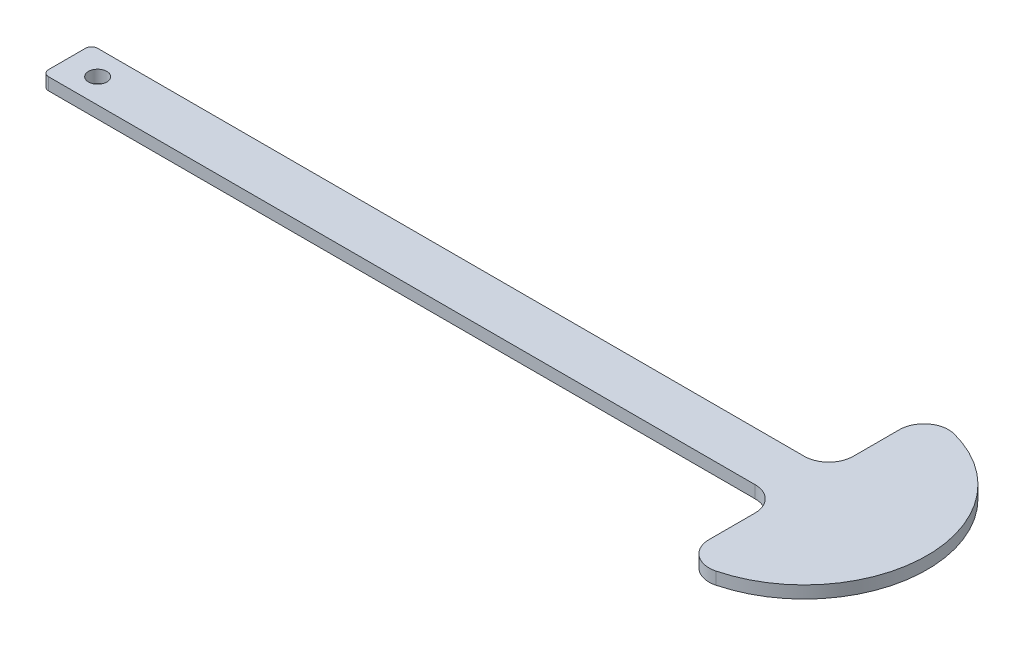
ISO-10303-21;
HEADER;
FILE_DESCRIPTION(('STEP AP214'),'2;1');
FILE_NAME('part.step','',(''),(''),'','','');
FILE_SCHEMA(('AUTOMOTIVE_DESIGN { 1 0 10303 214 1 1 1 1 }'));
ENDSEC;
DATA;
#1=APPLICATION_CONTEXT('core data for automotive mechanical design processes');
#2=APPLICATION_PROTOCOL_DEFINITION('international standard','automotive_design',2000,#1);
#3=PRODUCT_CONTEXT('',#1,'mechanical');
#4=PRODUCT('Part','Part','',(#3));
#5=PRODUCT_RELATED_PRODUCT_CATEGORY('part','',(#4));
#6=PRODUCT_DEFINITION_FORMATION('','',#4);
#7=PRODUCT_DEFINITION_CONTEXT('part definition',#1,'design');
#8=PRODUCT_DEFINITION('design','',#6,#7);
#9=PRODUCT_DEFINITION_SHAPE('','',#8);
#10=(LENGTH_UNIT() NAMED_UNIT(*) SI_UNIT(.MILLI.,.METRE.));
#11=(NAMED_UNIT(*) PLANE_ANGLE_UNIT() SI_UNIT($,.RADIAN.));
#12=(NAMED_UNIT(*) SI_UNIT($,.STERADIAN.) SOLID_ANGLE_UNIT());
#13=UNCERTAINTY_MEASURE_WITH_UNIT(LENGTH_MEASURE(1.E-05),#10,'distance_accuracy_value','');
#14=(GEOMETRIC_REPRESENTATION_CONTEXT(3) GLOBAL_UNCERTAINTY_ASSIGNED_CONTEXT((#13)) GLOBAL_UNIT_ASSIGNED_CONTEXT((#10,
#11,#12)) REPRESENTATION_CONTEXT('',''));
#15=CARTESIAN_POINT('',(0.,0.,0.));
#16=DIRECTION('',(0.,0.,1.));
#17=DIRECTION('',(1.,0.,0.));
#18=AXIS2_PLACEMENT_3D('',#15,#16,#17);
#19=CARTESIAN_POINT('',(55.9999999999999,2.,8.));
#20=DIRECTION('',(0.,-1.,0.));
#21=DIRECTION('',(0.,0.,-1.));
#22=AXIS2_PLACEMENT_3D('',#19,#20,#21);
#23=PLANE('',#22);
#24=CARTESIAN_POINT('',(55.9999999999999,2.,8.));
#25=DIRECTION('',(0.,-1.,0.));
#26=DIRECTION('',(0.,0.,-1.));
#27=AXIS2_PLACEMENT_3D('',#24,#25,#26);
#28=CIRCLE('',#27,4.);
#29=CARTESIAN_POINT('',(55.9999999999999,2.,4.));
#30=VERTEX_POINT('',#29);
#31=CARTESIAN_POINT('',(59.9999999999999,2.,8.00000000000003));
#32=VERTEX_POINT('',#31);
#33=EDGE_CURVE('E200',#30,#32,#28,.T.);
#34=ORIENTED_EDGE('',*,*,#33,.T.);
#35=DIRECTION('',(0.,0.,1.));
#36=VECTOR('',#35,1.);
#37=CARTESIAN_POINT('',(59.9999999999999,2.,8.00000000000003));
#38=LINE('',#37,#36);
#39=CARTESIAN_POINT('',(59.9999999999999,2.,15.4919333848297));
#40=VERTEX_POINT('',#39);
#41=EDGE_CURVE('E112',#32,#40,#38,.T.);
#42=ORIENTED_EDGE('',*,*,#41,.T.);
#43=CARTESIAN_POINT('',(63.9999999999999,2.,15.4919333848297));
#44=DIRECTION('',(0.,1.,0.));
#45=DIRECTION('',(0.,0.,1.));
#46=AXIS2_PLACEMENT_3D('',#43,#44,#45);
#47=CIRCLE('',#46,4.);
#48=CARTESIAN_POINT('',(64.9999999999999,2.,19.3649167310371));
#49=VERTEX_POINT('',#48);
#50=EDGE_CURVE('E237',#40,#49,#47,.T.);
#51=ORIENTED_EDGE('',*,*,#50,.T.);
#52=CARTESIAN_POINT('',(59.9999999999999,2.,0.));
#53=DIRECTION('',(0.,1.,0.));
#54=DIRECTION('',(0.,0.,1.));
#55=AXIS2_PLACEMENT_3D('',#52,#53,#54);
#56=CIRCLE('',#55,20.);
#57=CARTESIAN_POINT('',(64.9999999999999,2.,-19.3649167310371));
#58=VERTEX_POINT('',#57);
#59=EDGE_CURVE('E257',#49,#58,#56,.T.);
#60=ORIENTED_EDGE('',*,*,#59,.T.);
#61=CARTESIAN_POINT('',(63.9999999999999,2.,-15.4919333848297));
#62=DIRECTION('',(0.,1.,0.));
#63=DIRECTION('',(0.,0.,-1.));
#64=AXIS2_PLACEMENT_3D('',#61,#62,#63);
#65=CIRCLE('',#64,4.);
#66=CARTESIAN_POINT('',(59.9999999999999,2.,-15.4919333848297));
#67=VERTEX_POINT('',#66);
#68=EDGE_CURVE('E253',#58,#67,#65,.T.);
#69=ORIENTED_EDGE('',*,*,#68,.T.);
#70=DIRECTION('',(0.,0.,1.));
#71=VECTOR('',#70,1.);
#72=CARTESIAN_POINT('',(59.9999999999999,2.,-15.4919333848297));
#73=LINE('',#72,#71);
#74=CARTESIAN_POINT('',(59.9999999999999,2.,-8.00000000000003));
#75=VERTEX_POINT('',#74);
#76=EDGE_CURVE('E256',#67,#75,#73,.T.);
#77=ORIENTED_EDGE('',*,*,#76,.T.);
#78=CARTESIAN_POINT('',(55.9999999999999,2.,-8.));
#79=DIRECTION('',(0.,-1.,0.));
#80=DIRECTION('',(0.,0.,1.));
#81=AXIS2_PLACEMENT_3D('',#78,#79,#80);
#82=CIRCLE('',#81,4.);
#83=CARTESIAN_POINT('',(55.9999999999999,2.,-4.));
#84=VERTEX_POINT('',#83);
#85=EDGE_CURVE('E261',#75,#84,#82,.T.);
#86=ORIENTED_EDGE('',*,*,#85,.T.);
#87=DIRECTION('',(-1.,0.,0.));
#88=VECTOR('',#87,1.);
#89=CARTESIAN_POINT('',(-59.0000000000001,2.,-4.));
#90=LINE('',#89,#88);
#91=CARTESIAN_POINT('',(-59.0000000000001,2.,-4.));
#92=VERTEX_POINT('',#91);
#93=EDGE_CURVE('E268',#84,#92,#90,.T.);
#94=ORIENTED_EDGE('',*,*,#93,.T.);
#95=CARTESIAN_POINT('',(-59.0000000000001,2.,-3.));
#96=DIRECTION('',(0.,1.,0.));
#97=DIRECTION('',(0.,0.,1.));
#98=AXIS2_PLACEMENT_3D('',#95,#96,#97);
#99=CIRCLE('',#98,1.);
#100=CARTESIAN_POINT('',(-60.0000000000001,2.,-2.99999999999999));
#101=VERTEX_POINT('',#100);
#102=EDGE_CURVE('E143',#92,#101,#99,.T.);
#103=ORIENTED_EDGE('',*,*,#102,.T.);
#104=DIRECTION('',(0.,0.,1.));
#105=VECTOR('',#104,1.);
#106=CARTESIAN_POINT('',(-60.0000000000001,2.,-2.99999999999999));
#107=LINE('',#106,#105);
#108=CARTESIAN_POINT('',(-60.0000000000001,2.,2.99999999999999));
#109=VERTEX_POINT('',#108);
#110=EDGE_CURVE('E137',#101,#109,#107,.T.);
#111=ORIENTED_EDGE('',*,*,#110,.T.);
#112=CARTESIAN_POINT('',(-59.0000000000001,2.,3.));
#113=DIRECTION('',(0.,1.,0.));
#114=DIRECTION('',(0.,0.,1.));
#115=AXIS2_PLACEMENT_3D('',#112,#113,#114);
#116=CIRCLE('',#115,1.);
#117=CARTESIAN_POINT('',(-59.,2.,4.));
#118=VERTEX_POINT('',#117);
#119=EDGE_CURVE('E141',#109,#118,#116,.T.);
#120=ORIENTED_EDGE('',*,*,#119,.T.);
#121=DIRECTION('',(1.,0.,0.));
#122=VECTOR('',#121,1.);
#123=CARTESIAN_POINT('',(-59.,2.,4.));
#124=LINE('',#123,#122);
#125=EDGE_CURVE('E57',#118,#30,#124,.T.);
#126=ORIENTED_EDGE('',*,*,#125,.T.);
#127=EDGE_LOOP('',(#34,#42,#51,#60,#69,#77,#86,#94,#103,#111,#120,#126));
#128=FACE_BOUND('',#127,.T.);
#129=CARTESIAN_POINT('',(-55.0000000000001,2.,0.));
#130=DIRECTION('',(0.,1.,0.));
#131=DIRECTION('',(0.,0.,1.));
#132=AXIS2_PLACEMENT_3D('',#129,#130,#131);
#133=CIRCLE('',#132,1.5);
#134=CARTESIAN_POINT('',(-55.0000000000001,2.,1.5));
#135=VERTEX_POINT('',#134);
#136=EDGE_CURVE('E170',#135,#135,#133,.T.);
#137=ORIENTED_EDGE('',*,*,#136,.F.);
#138=EDGE_LOOP('',(#137));
#139=FACE_BOUND('',#138,.T.);
#140=ADVANCED_FACE('F39',(#128,#139),#23,.F.);
#141=CARTESIAN_POINT('',(55.9999999999999,0.,8.));
#142=DIRECTION('',(0.,-1.,0.));
#143=DIRECTION('',(0.,0.,-1.));
#144=AXIS2_PLACEMENT_3D('',#141,#142,#143);
#145=PLANE('',#144);
#146=CARTESIAN_POINT('',(55.9999999999999,0.,8.));
#147=DIRECTION('',(0.,-1.,0.));
#148=DIRECTION('',(0.,0.,-1.));
#149=AXIS2_PLACEMENT_3D('',#146,#147,#148);
#150=CIRCLE('',#149,4.);
#151=CARTESIAN_POINT('',(55.9999999999999,0.,4.));
#152=VERTEX_POINT('',#151);
#153=CARTESIAN_POINT('',(59.9999999999999,0.,8.00000000000003));
#154=VERTEX_POINT('',#153);
#155=EDGE_CURVE('E165',#152,#154,#150,.T.);
#156=ORIENTED_EDGE('',*,*,#155,.F.);
#157=DIRECTION('',(1.,0.,0.));
#158=VECTOR('',#157,1.);
#159=CARTESIAN_POINT('',(-59.,0.,4.));
#160=LINE('',#159,#158);
#161=CARTESIAN_POINT('',(-59.,0.,4.));
#162=VERTEX_POINT('',#161);
#163=EDGE_CURVE('E104',#162,#152,#160,.T.);
#164=ORIENTED_EDGE('',*,*,#163,.F.);
#165=CARTESIAN_POINT('',(-59.0000000000001,0.,3.));
#166=DIRECTION('',(0.,1.,0.));
#167=DIRECTION('',(0.,0.,1.));
#168=AXIS2_PLACEMENT_3D('',#165,#166,#167);
#169=CIRCLE('',#168,1.);
#170=CARTESIAN_POINT('',(-60.0000000000001,0.,2.99999999999999));
#171=VERTEX_POINT('',#170);
#172=EDGE_CURVE('E98',#171,#162,#169,.T.);
#173=ORIENTED_EDGE('',*,*,#172,.F.);
#174=DIRECTION('',(0.,0.,1.));
#175=VECTOR('',#174,1.);
#176=CARTESIAN_POINT('',(-60.0000000000001,0.,-2.99999999999999));
#177=LINE('',#176,#175);
#178=CARTESIAN_POINT('',(-60.0000000000001,0.,-2.99999999999999));
#179=VERTEX_POINT('',#178);
#180=EDGE_CURVE('E152',#179,#171,#177,.T.);
#181=ORIENTED_EDGE('',*,*,#180,.F.);
#182=CARTESIAN_POINT('',(-59.0000000000001,0.,-3.));
#183=DIRECTION('',(0.,1.,0.));
#184=DIRECTION('',(0.,0.,1.));
#185=AXIS2_PLACEMENT_3D('',#182,#183,#184);
#186=CIRCLE('',#185,1.);
#187=CARTESIAN_POINT('',(-59.0000000000001,0.,-4.));
#188=VERTEX_POINT('',#187);
#189=EDGE_CURVE('E191',#188,#179,#186,.T.);
#190=ORIENTED_EDGE('',*,*,#189,.F.);
#191=DIRECTION('',(-1.,0.,0.));
#192=VECTOR('',#191,1.);
#193=CARTESIAN_POINT('',(-59.0000000000001,0.,-4.));
#194=LINE('',#193,#192);
#195=CARTESIAN_POINT('',(55.9999999999999,0.,-4.));
#196=VERTEX_POINT('',#195);
#197=EDGE_CURVE('E188',#196,#188,#194,.T.);
#198=ORIENTED_EDGE('',*,*,#197,.F.);
#199=CARTESIAN_POINT('',(55.9999999999999,0.,-8.));
#200=DIRECTION('',(0.,-1.,0.));
#201=DIRECTION('',(0.,0.,1.));
#202=AXIS2_PLACEMENT_3D('',#199,#200,#201);
#203=CIRCLE('',#202,4.);
#204=CARTESIAN_POINT('',(59.9999999999999,0.,-8.00000000000003));
#205=VERTEX_POINT('',#204);
#206=EDGE_CURVE('E185',#205,#196,#203,.T.);
#207=ORIENTED_EDGE('',*,*,#206,.F.);
#208=DIRECTION('',(0.,0.,1.));
#209=VECTOR('',#208,1.);
#210=CARTESIAN_POINT('',(59.9999999999999,0.,-15.4919333848297));
#211=LINE('',#210,#209);
#212=CARTESIAN_POINT('',(59.9999999999999,0.,-15.4919333848297));
#213=VERTEX_POINT('',#212);
#214=EDGE_CURVE('E182',#213,#205,#211,.T.);
#215=ORIENTED_EDGE('',*,*,#214,.F.);
#216=CARTESIAN_POINT('',(63.9999999999999,0.,-15.4919333848297));
#217=DIRECTION('',(0.,1.,0.));
#218=DIRECTION('',(0.,0.,-1.));
#219=AXIS2_PLACEMENT_3D('',#216,#217,#218);
#220=CIRCLE('',#219,4.);
#221=CARTESIAN_POINT('',(64.9999999999999,0.,-19.3649167310371));
#222=VERTEX_POINT('',#221);
#223=EDGE_CURVE('E179',#222,#213,#220,.T.);
#224=ORIENTED_EDGE('',*,*,#223,.F.);
#225=CARTESIAN_POINT('',(59.9999999999999,0.,0.));
#226=DIRECTION('',(0.,1.,0.));
#227=DIRECTION('',(0.,0.,1.));
#228=AXIS2_PLACEMENT_3D('',#225,#226,#227);
#229=CIRCLE('',#228,20.);
#230=CARTESIAN_POINT('',(64.9999999999999,0.,19.3649167310371));
#231=VERTEX_POINT('',#230);
#232=EDGE_CURVE('E176',#231,#222,#229,.T.);
#233=ORIENTED_EDGE('',*,*,#232,.F.);
#234=CARTESIAN_POINT('',(63.9999999999999,0.,15.4919333848297));
#235=DIRECTION('',(0.,1.,0.));
#236=DIRECTION('',(0.,0.,1.));
#237=AXIS2_PLACEMENT_3D('',#234,#235,#236);
#238=CIRCLE('',#237,4.);
#239=CARTESIAN_POINT('',(59.9999999999999,0.,15.4919333848297));
#240=VERTEX_POINT('',#239);
#241=EDGE_CURVE('E173',#240,#231,#238,.T.);
#242=ORIENTED_EDGE('',*,*,#241,.F.);
#243=DIRECTION('',(0.,0.,1.));
#244=VECTOR('',#243,1.);
#245=CARTESIAN_POINT('',(59.9999999999999,0.,8.00000000000003));
#246=LINE('',#245,#244);
#247=EDGE_CURVE('E169',#154,#240,#246,.T.);
#248=ORIENTED_EDGE('',*,*,#247,.F.);
#249=EDGE_LOOP('',(#156,#164,#173,#181,#190,#198,#207,#215,#224,#233,#242,#248));
#250=FACE_BOUND('',#249,.T.);
#251=CARTESIAN_POINT('',(-55.0000000000001,0.,0.));
#252=DIRECTION('',(0.,1.,0.));
#253=DIRECTION('',(0.,0.,1.));
#254=AXIS2_PLACEMENT_3D('',#251,#252,#253);
#255=CIRCLE('',#254,1.5);
#256=CARTESIAN_POINT('',(-55.0000000000001,0.,1.5));
#257=VERTEX_POINT('',#256);
#258=EDGE_CURVE('E417',#257,#257,#255,.T.);
#259=ORIENTED_EDGE('',*,*,#258,.T.);
#260=EDGE_LOOP('',(#259));
#261=FACE_BOUND('',#260,.T.);
#262=ADVANCED_FACE('F241',(#250,#261),#145,.T.);
#263=CARTESIAN_POINT('',(55.9999999999999,2.,8.));
#264=DIRECTION('',(0.,-1.,0.));
#265=DIRECTION('',(0.,0.,-1.));
#266=AXIS2_PLACEMENT_3D('',#263,#264,#265);
#267=CYLINDRICAL_SURFACE('',#266,4.);
#268=ORIENTED_EDGE('',*,*,#155,.T.);
#269=DIRECTION('',(0.,-1.,0.));
#270=VECTOR('',#269,1.);
#271=CARTESIAN_POINT('',(59.9999999999999,2.,8.00000000000003));
#272=LINE('',#271,#270);
#273=EDGE_CURVE('E11',#32,#154,#272,.T.);
#274=ORIENTED_EDGE('',*,*,#273,.F.);
#275=ORIENTED_EDGE('',*,*,#33,.F.);
#276=DIRECTION('',(0.,-1.,0.));
#277=VECTOR('',#276,1.);
#278=CARTESIAN_POINT('',(55.9999999999999,2.,4.));
#279=LINE('',#278,#277);
#280=EDGE_CURVE('E161',#30,#152,#279,.T.);
#281=ORIENTED_EDGE('',*,*,#280,.T.);
#282=EDGE_LOOP('',(#268,#274,#275,#281));
#283=FACE_BOUND('',#282,.T.);
#284=ADVANCED_FACE('F41',(#283),#267,.F.);
#285=CARTESIAN_POINT('',(59.9999999999999,2.,8.00000000000003));
#286=DIRECTION('',(1.,0.,0.));
#287=DIRECTION('',(0.,0.,-1.));
#288=AXIS2_PLACEMENT_3D('',#285,#286,#287);
#289=PLANE('',#288);
#290=ORIENTED_EDGE('',*,*,#247,.T.);
#291=DIRECTION('',(0.,-1.,0.));
#292=VECTOR('',#291,1.);
#293=CARTESIAN_POINT('',(59.9999999999999,2.,15.4919333848297));
#294=LINE('',#293,#292);
#295=EDGE_CURVE('E49',#40,#240,#294,.T.);
#296=ORIENTED_EDGE('',*,*,#295,.F.);
#297=ORIENTED_EDGE('',*,*,#41,.F.);
#298=ORIENTED_EDGE('',*,*,#273,.T.);
#299=EDGE_LOOP('',(#290,#296,#297,#298));
#300=FACE_BOUND('',#299,.T.);
#301=ADVANCED_FACE('F304',(#300),#289,.F.);
#302=CARTESIAN_POINT('',(63.9999999999999,2.,15.4919333848297));
#303=DIRECTION('',(0.,-1.,0.));
#304=DIRECTION('',(0.,0.,-1.));
#305=AXIS2_PLACEMENT_3D('',#302,#303,#304);
#306=CYLINDRICAL_SURFACE('',#305,4.);
#307=ORIENTED_EDGE('',*,*,#241,.T.);
#308=DIRECTION('',(0.,-1.,0.));
#309=VECTOR('',#308,1.);
#310=CARTESIAN_POINT('',(64.9999999999999,2.,19.3649167310371));
#311=LINE('',#310,#309);
#312=EDGE_CURVE('E227',#49,#231,#311,.T.);
#313=ORIENTED_EDGE('',*,*,#312,.F.);
#314=ORIENTED_EDGE('',*,*,#50,.F.);
#315=ORIENTED_EDGE('',*,*,#295,.T.);
#316=EDGE_LOOP('',(#307,#313,#314,#315));
#317=FACE_BOUND('',#316,.T.);
#318=ADVANCED_FACE('F235',(#317),#306,.T.);
#319=CARTESIAN_POINT('',(59.9999999999999,2.,0.));
#320=DIRECTION('',(0.,-1.,0.));
#321=DIRECTION('',(0.,0.,-1.));
#322=AXIS2_PLACEMENT_3D('',#319,#320,#321);
#323=CYLINDRICAL_SURFACE('',#322,20.);
#324=ORIENTED_EDGE('',*,*,#232,.T.);
#325=DIRECTION('',(0.,-1.,0.));
#326=VECTOR('',#325,1.);
#327=CARTESIAN_POINT('',(64.9999999999999,2.,-19.3649167310371));
#328=LINE('',#327,#326);
#329=EDGE_CURVE('E223',#58,#222,#328,.T.);
#330=ORIENTED_EDGE('',*,*,#329,.F.);
#331=ORIENTED_EDGE('',*,*,#59,.F.);
#332=ORIENTED_EDGE('',*,*,#312,.T.);
#333=EDGE_LOOP('',(#324,#330,#331,#332));
#334=FACE_BOUND('',#333,.T.);
#335=ADVANCED_FACE('F247',(#334),#323,.T.);
#336=CARTESIAN_POINT('',(63.9999999999999,2.,-15.4919333848297));
#337=DIRECTION('',(0.,-1.,0.));
#338=DIRECTION('',(0.,0.,-1.));
#339=AXIS2_PLACEMENT_3D('',#336,#337,#338);
#340=CYLINDRICAL_SURFACE('',#339,4.);
#341=ORIENTED_EDGE('',*,*,#223,.T.);
#342=DIRECTION('',(0.,-1.,0.));
#343=VECTOR('',#342,1.);
#344=CARTESIAN_POINT('',(59.9999999999999,2.,-15.4919333848297));
#345=LINE('',#344,#343);
#346=EDGE_CURVE('E219',#67,#213,#345,.T.);
#347=ORIENTED_EDGE('',*,*,#346,.F.);
#348=ORIENTED_EDGE('',*,*,#68,.F.);
#349=ORIENTED_EDGE('',*,*,#329,.T.);
#350=EDGE_LOOP('',(#341,#347,#348,#349));
#351=FACE_BOUND('',#350,.T.);
#352=ADVANCED_FACE('F251',(#351),#340,.T.);
#353=CARTESIAN_POINT('',(59.9999999999999,2.,-15.4919333848297));
#354=DIRECTION('',(1.,0.,0.));
#355=DIRECTION('',(0.,0.,-1.));
#356=AXIS2_PLACEMENT_3D('',#353,#354,#355);
#357=PLANE('',#356);
#358=ORIENTED_EDGE('',*,*,#214,.T.);
#359=DIRECTION('',(0.,-1.,0.));
#360=VECTOR('',#359,1.);
#361=CARTESIAN_POINT('',(59.9999999999999,2.,-8.00000000000003));
#362=LINE('',#361,#360);
#363=EDGE_CURVE('E215',#75,#205,#362,.T.);
#364=ORIENTED_EDGE('',*,*,#363,.F.);
#365=ORIENTED_EDGE('',*,*,#76,.F.);
#366=ORIENTED_EDGE('',*,*,#346,.T.);
#367=EDGE_LOOP('',(#358,#364,#365,#366));
#368=FACE_BOUND('',#367,.T.);
#369=ADVANCED_FACE('F317',(#368),#357,.F.);
#370=CARTESIAN_POINT('',(55.9999999999999,2.,-8.));
#371=DIRECTION('',(0.,-1.,0.));
#372=DIRECTION('',(0.,0.,-1.));
#373=AXIS2_PLACEMENT_3D('',#370,#371,#372);
#374=CYLINDRICAL_SURFACE('',#373,4.);
#375=ORIENTED_EDGE('',*,*,#206,.T.);
#376=DIRECTION('',(0.,-1.,0.));
#377=VECTOR('',#376,1.);
#378=CARTESIAN_POINT('',(55.9999999999999,2.,-4.));
#379=LINE('',#378,#377);
#380=EDGE_CURVE('E211',#84,#196,#379,.T.);
#381=ORIENTED_EDGE('',*,*,#380,.F.);
#382=ORIENTED_EDGE('',*,*,#85,.F.);
#383=ORIENTED_EDGE('',*,*,#363,.T.);
#384=EDGE_LOOP('',(#375,#381,#382,#383));
#385=FACE_BOUND('',#384,.T.);
#386=ADVANCED_FACE('F320',(#385),#374,.F.);
#387=CARTESIAN_POINT('',(-59.0000000000001,2.,-4.));
#388=DIRECTION('',(0.,0.,1.));
#389=DIRECTION('',(1.,0.,0.));
#390=AXIS2_PLACEMENT_3D('',#387,#388,#389);
#391=PLANE('',#390);
#392=ORIENTED_EDGE('',*,*,#197,.T.);
#393=DIRECTION('',(0.,-1.,0.));
#394=VECTOR('',#393,1.);
#395=CARTESIAN_POINT('',(-59.0000000000001,2.,-4.));
#396=LINE('',#395,#394);
#397=EDGE_CURVE('E207',#92,#188,#396,.T.);
#398=ORIENTED_EDGE('',*,*,#397,.F.);
#399=ORIENTED_EDGE('',*,*,#93,.F.);
#400=ORIENTED_EDGE('',*,*,#380,.T.);
#401=EDGE_LOOP('',(#392,#398,#399,#400));
#402=FACE_BOUND('',#401,.T.);
#403=ADVANCED_FACE('F276',(#402),#391,.F.);
#404=CARTESIAN_POINT('',(-59.0000000000001,2.,-3.));
#405=DIRECTION('',(0.,-1.,0.));
#406=DIRECTION('',(0.,0.,-1.));
#407=AXIS2_PLACEMENT_3D('',#404,#405,#406);
#408=CYLINDRICAL_SURFACE('',#407,1.);
#409=ORIENTED_EDGE('',*,*,#189,.T.);
#410=DIRECTION('',(0.,-1.,0.));
#411=VECTOR('',#410,1.);
#412=CARTESIAN_POINT('',(-60.0000000000001,2.,-2.99999999999999));
#413=LINE('',#412,#411);
#414=EDGE_CURVE('E154',#101,#179,#413,.T.);
#415=ORIENTED_EDGE('',*,*,#414,.F.);
#416=ORIENTED_EDGE('',*,*,#102,.F.);
#417=ORIENTED_EDGE('',*,*,#397,.T.);
#418=EDGE_LOOP('',(#409,#415,#416,#417));
#419=FACE_BOUND('',#418,.T.);
#420=ADVANCED_FACE('F280',(#419),#408,.T.);
#421=CARTESIAN_POINT('',(-60.0000000000001,2.,-2.99999999999999));
#422=DIRECTION('',(1.,0.,0.));
#423=DIRECTION('',(0.,0.,-1.));
#424=AXIS2_PLACEMENT_3D('',#421,#422,#423);
#425=PLANE('',#424);
#426=ORIENTED_EDGE('',*,*,#180,.T.);
#427=DIRECTION('',(0.,-1.,0.));
#428=VECTOR('',#427,1.);
#429=CARTESIAN_POINT('',(-60.0000000000001,2.,2.99999999999999));
#430=LINE('',#429,#428);
#431=EDGE_CURVE('E149',#109,#171,#430,.T.);
#432=ORIENTED_EDGE('',*,*,#431,.F.);
#433=ORIENTED_EDGE('',*,*,#110,.F.);
#434=ORIENTED_EDGE('',*,*,#414,.T.);
#435=EDGE_LOOP('',(#426,#432,#433,#434));
#436=FACE_BOUND('',#435,.T.);
#437=ADVANCED_FACE('F150',(#436),#425,.F.);
#438=CARTESIAN_POINT('',(-59.0000000000001,2.,3.));
#439=DIRECTION('',(0.,-1.,0.));
#440=DIRECTION('',(0.,0.,-1.));
#441=AXIS2_PLACEMENT_3D('',#438,#439,#440);
#442=CYLINDRICAL_SURFACE('',#441,1.);
#443=ORIENTED_EDGE('',*,*,#172,.T.);
#444=DIRECTION('',(0.,-1.,0.));
#445=VECTOR('',#444,1.);
#446=CARTESIAN_POINT('',(-59.,2.,4.));
#447=LINE('',#446,#445);
#448=EDGE_CURVE('E155',#118,#162,#447,.T.);
#449=ORIENTED_EDGE('',*,*,#448,.F.);
#450=ORIENTED_EDGE('',*,*,#119,.F.);
#451=ORIENTED_EDGE('',*,*,#431,.T.);
#452=EDGE_LOOP('',(#443,#449,#450,#451));
#453=FACE_BOUND('',#452,.T.);
#454=ADVANCED_FACE('F157',(#453),#442,.T.);
#455=CARTESIAN_POINT('',(-59.,2.,4.));
#456=DIRECTION('',(0.,0.,-1.));
#457=DIRECTION('',(-1.,0.,0.));
#458=AXIS2_PLACEMENT_3D('',#455,#456,#457);
#459=PLANE('',#458);
#460=ORIENTED_EDGE('',*,*,#163,.T.);
#461=ORIENTED_EDGE('',*,*,#280,.F.);
#462=ORIENTED_EDGE('',*,*,#125,.F.);
#463=ORIENTED_EDGE('',*,*,#448,.T.);
#464=EDGE_LOOP('',(#460,#461,#462,#463));
#465=FACE_BOUND('',#464,.T.);
#466=ADVANCED_FACE('F284',(#465),#459,.F.);
#467=CARTESIAN_POINT('',(-55.0000000000001,2.,0.));
#468=DIRECTION('',(0.,-1.,0.));
#469=DIRECTION('',(0.,0.,-1.));
#470=AXIS2_PLACEMENT_3D('',#467,#468,#469);
#471=CYLINDRICAL_SURFACE('',#470,1.5);
#472=ORIENTED_EDGE('',*,*,#136,.T.);
#473=EDGE_LOOP('',(#472));
#474=FACE_BOUND('',#473,.T.);
#475=ORIENTED_EDGE('',*,*,#258,.F.);
#476=EDGE_LOOP('',(#475));
#477=FACE_BOUND('',#476,.T.);
#478=ADVANCED_FACE('F286',(#474,#477),#471,.F.);
#479=CLOSED_SHELL('',(#140,#262,#284,#301,#318,#335,#352,#369,#386,#403,#420,#437,#454,#466,#478));
#480=MANIFOLD_SOLID_BREP('B2',#479);
#481=ADVANCED_BREP_SHAPE_REPRESENTATION('',(#18,#480),#14);
#482=SHAPE_DEFINITION_REPRESENTATION(#9,#481);
ENDSEC;
END-ISO-10303-21;
